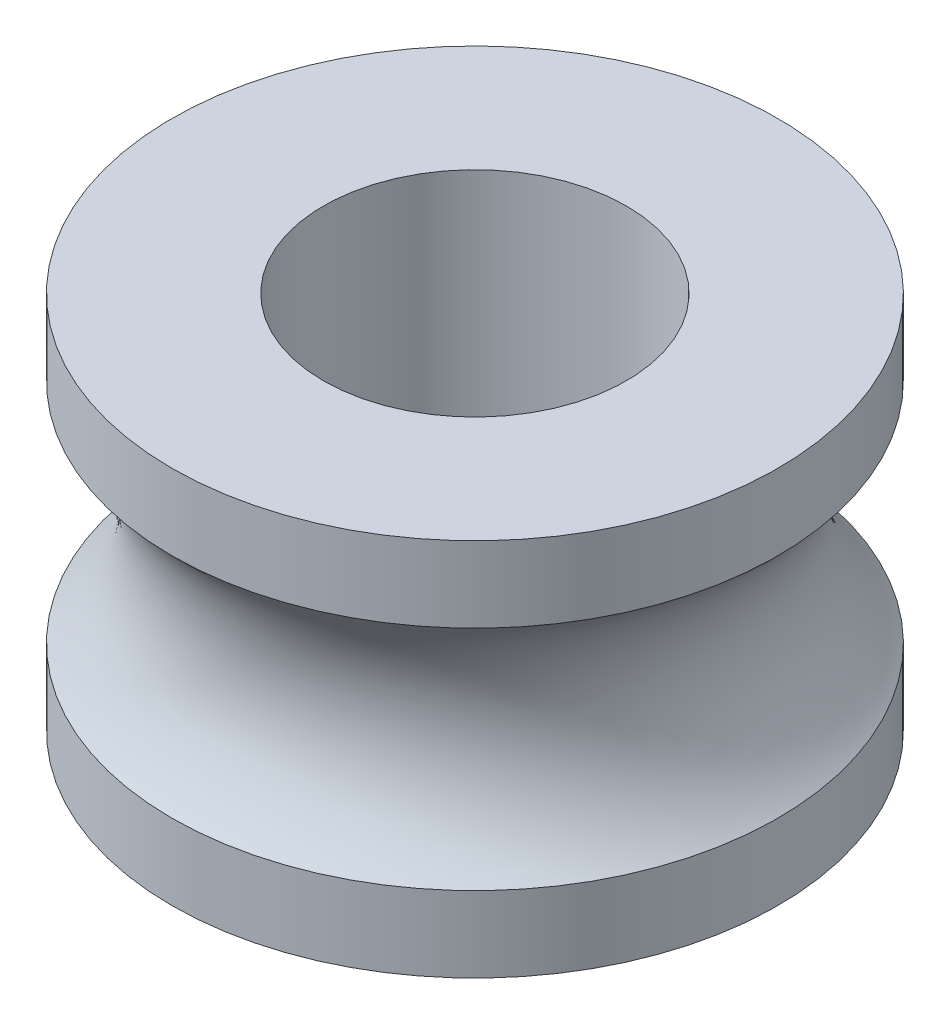
ISO-10303-21;
HEADER;
FILE_DESCRIPTION(('STEP AP214'),'2;1');
FILE_NAME('part.step','',(''),(''),'','','');
FILE_SCHEMA(('AUTOMOTIVE_DESIGN { 1 0 10303 214 1 1 1 1 }'));
ENDSEC;
DATA;
#1=APPLICATION_CONTEXT('core data for automotive mechanical design processes');
#2=APPLICATION_PROTOCOL_DEFINITION('international standard','automotive_design',2000,#1);
#3=PRODUCT_CONTEXT('',#1,'mechanical');
#4=PRODUCT('Part','Part','',(#3));
#5=PRODUCT_RELATED_PRODUCT_CATEGORY('part','',(#4));
#6=PRODUCT_DEFINITION_FORMATION('','',#4);
#7=PRODUCT_DEFINITION_CONTEXT('part definition',#1,'design');
#8=PRODUCT_DEFINITION('design','',#6,#7);
#9=PRODUCT_DEFINITION_SHAPE('','',#8);
#10=(LENGTH_UNIT() NAMED_UNIT(*) SI_UNIT(.MILLI.,.METRE.));
#11=(NAMED_UNIT(*) PLANE_ANGLE_UNIT() SI_UNIT($,.RADIAN.));
#12=(NAMED_UNIT(*) SI_UNIT($,.STERADIAN.) SOLID_ANGLE_UNIT());
#13=UNCERTAINTY_MEASURE_WITH_UNIT(LENGTH_MEASURE(1.E-05),#10,'distance_accuracy_value','');
#14=(GEOMETRIC_REPRESENTATION_CONTEXT(3) GLOBAL_UNCERTAINTY_ASSIGNED_CONTEXT((#13)) GLOBAL_UNIT_ASSIGNED_CONTEXT((#10,
#11,#12)) REPRESENTATION_CONTEXT('',''));
#15=CARTESIAN_POINT('',(0.,0.,0.));
#16=DIRECTION('',(0.,0.,1.));
#17=DIRECTION('',(1.,0.,0.));
#18=AXIS2_PLACEMENT_3D('',#15,#16,#17);
#19=CARTESIAN_POINT('',(2.,-2.5,0.));
#20=DIRECTION('',(0.,1.,0.));
#21=DIRECTION('',(0.,0.,1.));
#22=AXIS2_PLACEMENT_3D('',#19,#20,#21);
#23=PLANE('',#22);
#24=CARTESIAN_POINT('',(0.,-2.5,0.));
#25=DIRECTION('',(0.,1.,0.));
#26=DIRECTION('',(0.,0.,1.));
#27=AXIS2_PLACEMENT_3D('',#24,#25,#26);
#28=CIRCLE('',#27,4.);
#29=CARTESIAN_POINT('',(0.,-2.5,4.));
#30=VERTEX_POINT('',#29);
#31=EDGE_CURVE('E10',#30,#30,#28,.T.);
#32=ORIENTED_EDGE('',*,*,#31,.F.);
#33=EDGE_LOOP('',(#32));
#34=FACE_BOUND('',#33,.T.);
#35=CARTESIAN_POINT('',(0.,-2.5,0.));
#36=DIRECTION('',(0.,1.,0.));
#37=DIRECTION('',(0.,0.,1.));
#38=AXIS2_PLACEMENT_3D('',#35,#36,#37);
#39=CIRCLE('',#38,2.);
#40=CARTESIAN_POINT('',(0.,-2.5,2.));
#41=VERTEX_POINT('',#40);
#42=EDGE_CURVE('E55',#41,#41,#39,.T.);
#43=ORIENTED_EDGE('',*,*,#42,.T.);
#44=EDGE_LOOP('',(#43));
#45=FACE_BOUND('',#44,.T.);
#46=ADVANCED_FACE('F33',(#34,#45),#23,.F.);
#47=CARTESIAN_POINT('',(0.,2.,0.));
#48=DIRECTION('',(0.,1.,0.));
#49=DIRECTION('',(0.,0.,1.));
#50=AXIS2_PLACEMENT_3D('',#47,#48,#49);
#51=CYLINDRICAL_SURFACE('',#50,4.);
#52=CARTESIAN_POINT('',(0.,-1.5,0.));
#53=DIRECTION('',(0.,1.,0.));
#54=DIRECTION('',(0.,0.,1.));
#55=AXIS2_PLACEMENT_3D('',#52,#53,#54);
#56=CIRCLE('',#55,4.);
#57=CARTESIAN_POINT('',(0.,-1.5,4.));
#58=VERTEX_POINT('',#57);
#59=EDGE_CURVE('E39',#58,#58,#56,.T.);
#60=ORIENTED_EDGE('',*,*,#59,.F.);
#61=EDGE_LOOP('',(#60));
#62=FACE_BOUND('',#61,.T.);
#63=ORIENTED_EDGE('',*,*,#31,.T.);
#64=EDGE_LOOP('',(#63));
#65=FACE_BOUND('',#64,.T.);
#66=ADVANCED_FACE('F80',(#62,#65),#51,.T.);
#67=CARTESIAN_POINT('',(0.,0.,0.));
#68=DIRECTION('',(0.,1.,0.));
#69=DIRECTION('',(0.,0.,1.));
#70=AXIS2_PLACEMENT_3D('',#67,#68,#69);
#71=TOROIDAL_SURFACE('',#70,5.32287565553229,2.);
#72=CARTESIAN_POINT('',(0.,1.5,0.));
#73=DIRECTION('',(0.,1.,0.));
#74=DIRECTION('',(0.,0.,1.));
#75=AXIS2_PLACEMENT_3D('',#72,#73,#74);
#76=CIRCLE('',#75,4.);
#77=CARTESIAN_POINT('',(0.,1.5,4.));
#78=VERTEX_POINT('',#77);
#79=EDGE_CURVE('E43',#78,#78,#76,.T.);
#80=ORIENTED_EDGE('',*,*,#79,.F.);
#81=EDGE_LOOP('',(#80));
#82=FACE_BOUND('',#81,.T.);
#83=ORIENTED_EDGE('',*,*,#59,.T.);
#84=EDGE_LOOP('',(#83));
#85=FACE_BOUND('',#84,.T.);
#86=ADVANCED_FACE('F75',(#82,#85),#71,.F.);
#87=CARTESIAN_POINT('',(0.,2.,0.));
#88=DIRECTION('',(0.,1.,0.));
#89=DIRECTION('',(0.,0.,1.));
#90=AXIS2_PLACEMENT_3D('',#87,#88,#89);
#91=CYLINDRICAL_SURFACE('',#90,4.);
#92=CARTESIAN_POINT('',(0.,2.5,0.));
#93=DIRECTION('',(0.,1.,0.));
#94=DIRECTION('',(0.,0.,1.));
#95=AXIS2_PLACEMENT_3D('',#92,#93,#94);
#96=CIRCLE('',#95,4.);
#97=CARTESIAN_POINT('',(0.,2.5,4.));
#98=VERTEX_POINT('',#97);
#99=EDGE_CURVE('E47',#98,#98,#96,.T.);
#100=ORIENTED_EDGE('',*,*,#99,.F.);
#101=EDGE_LOOP('',(#100));
#102=FACE_BOUND('',#101,.T.);
#103=ORIENTED_EDGE('',*,*,#79,.T.);
#104=EDGE_LOOP('',(#103));
#105=FACE_BOUND('',#104,.T.);
#106=ADVANCED_FACE('F69',(#102,#105),#91,.T.);
#107=CARTESIAN_POINT('',(2.,2.5,0.));
#108=DIRECTION('',(0.,-1.,0.));
#109=DIRECTION('',(0.,0.,-1.));
#110=AXIS2_PLACEMENT_3D('',#107,#108,#109);
#111=PLANE('',#110);
#112=CARTESIAN_POINT('',(0.,2.5,0.));
#113=DIRECTION('',(0.,1.,0.));
#114=DIRECTION('',(0.,0.,1.));
#115=AXIS2_PLACEMENT_3D('',#112,#113,#114);
#116=CIRCLE('',#115,2.);
#117=CARTESIAN_POINT('',(0.,2.5,2.));
#118=VERTEX_POINT('',#117);
#119=EDGE_CURVE('E52',#118,#118,#116,.T.);
#120=ORIENTED_EDGE('',*,*,#119,.F.);
#121=EDGE_LOOP('',(#120));
#122=FACE_BOUND('',#121,.T.);
#123=ORIENTED_EDGE('',*,*,#99,.T.);
#124=EDGE_LOOP('',(#123));
#125=FACE_BOUND('',#124,.T.);
#126=ADVANCED_FACE('F63',(#122,#125),#111,.F.);
#127=CARTESIAN_POINT('',(0.,2.,0.));
#128=DIRECTION('',(0.,1.,0.));
#129=DIRECTION('',(0.,0.,1.));
#130=AXIS2_PLACEMENT_3D('',#127,#128,#129);
#131=CYLINDRICAL_SURFACE('',#130,2.);
#132=ORIENTED_EDGE('',*,*,#42,.F.);
#133=EDGE_LOOP('',(#132));
#134=FACE_BOUND('',#133,.T.);
#135=ORIENTED_EDGE('',*,*,#119,.T.);
#136=EDGE_LOOP('',(#135));
#137=FACE_BOUND('',#136,.T.);
#138=ADVANCED_FACE('F60',(#134,#137),#131,.F.);
#139=CLOSED_SHELL('',(#46,#66,#86,#106,#126,#138));
#140=MANIFOLD_SOLID_BREP('B2',#139);
#141=ADVANCED_BREP_SHAPE_REPRESENTATION('',(#18,#140),#14);
#142=SHAPE_DEFINITION_REPRESENTATION(#9,#141);
ENDSEC;
END-ISO-10303-21;
